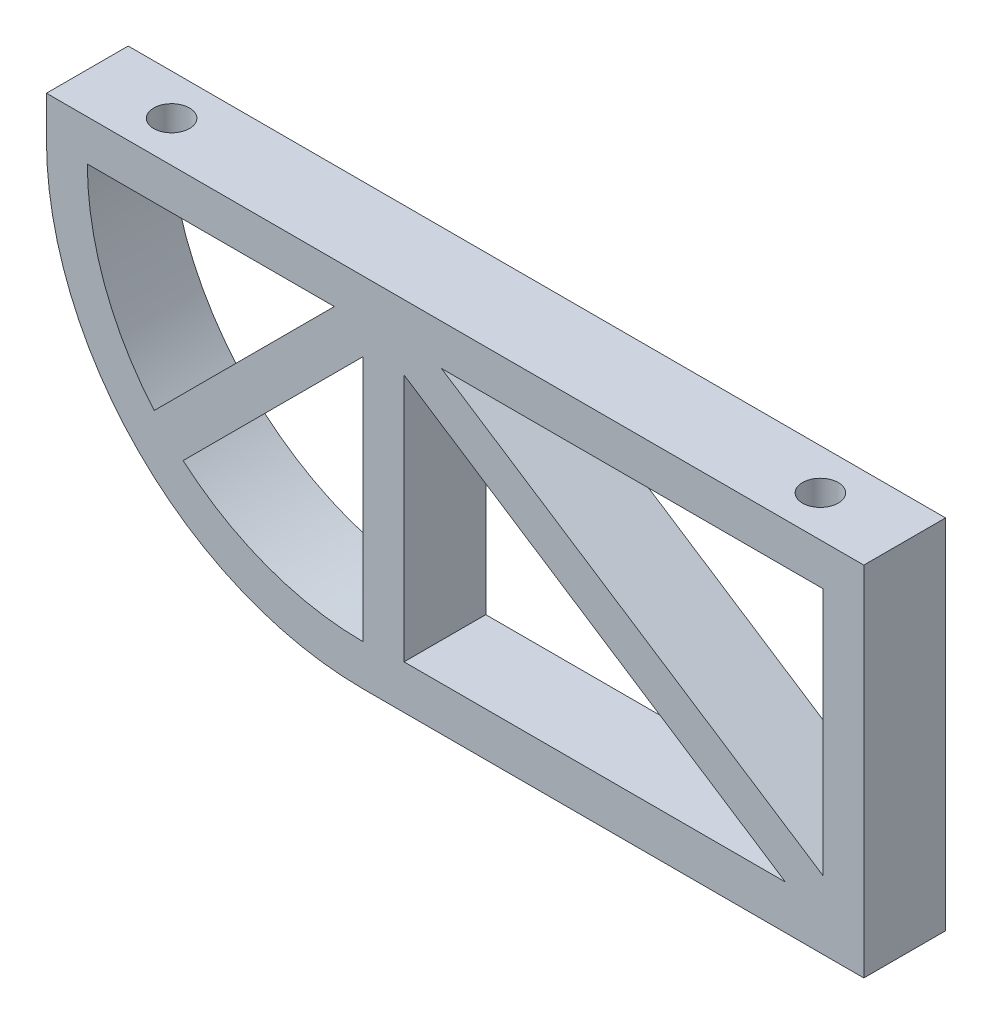
ISO-10303-21;
HEADER;
FILE_DESCRIPTION(('STEP AP214'),'2;1');
FILE_NAME('part.step','',(''),(''),'','','');
FILE_SCHEMA(('AUTOMOTIVE_DESIGN { 1 0 10303 214 1 1 1 1 }'));
ENDSEC;
DATA;
#1=APPLICATION_CONTEXT('core data for automotive mechanical design processes');
#2=APPLICATION_PROTOCOL_DEFINITION('international standard','automotive_design',2000,#1);
#3=PRODUCT_CONTEXT('',#1,'mechanical');
#4=PRODUCT('Part','Part','',(#3));
#5=PRODUCT_RELATED_PRODUCT_CATEGORY('part','',(#4));
#6=PRODUCT_DEFINITION_FORMATION('','',#4);
#7=PRODUCT_DEFINITION_CONTEXT('part definition',#1,'design');
#8=PRODUCT_DEFINITION('design','',#6,#7);
#9=PRODUCT_DEFINITION_SHAPE('','',#8);
#10=(LENGTH_UNIT() NAMED_UNIT(*) SI_UNIT(.MILLI.,.METRE.));
#11=(NAMED_UNIT(*) PLANE_ANGLE_UNIT() SI_UNIT($,.RADIAN.));
#12=(NAMED_UNIT(*) SI_UNIT($,.STERADIAN.) SOLID_ANGLE_UNIT());
#13=UNCERTAINTY_MEASURE_WITH_UNIT(LENGTH_MEASURE(1.E-05),#10,'distance_accuracy_value','');
#14=(GEOMETRIC_REPRESENTATION_CONTEXT(3) GLOBAL_UNCERTAINTY_ASSIGNED_CONTEXT((#13)) GLOBAL_UNIT_ASSIGNED_CONTEXT((#10,
#11,#12)) REPRESENTATION_CONTEXT('',''));
#15=CARTESIAN_POINT('',(0.,0.,0.));
#16=DIRECTION('',(0.,0.,1.));
#17=DIRECTION('',(1.,0.,0.));
#18=AXIS2_PLACEMENT_3D('',#15,#16,#17);
#19=CARTESIAN_POINT('',(4.89844082211197,12.6074060949681,8.));
#20=DIRECTION('',(0.,0.,-1.));
#21=DIRECTION('',(-1.,0.,0.));
#22=AXIS2_PLACEMENT_3D('',#19,#20,#21);
#23=CYLINDRICAL_SURFACE('',#22,27.);
#24=CARTESIAN_POINT('',(4.89844082211197,12.6074060949681,0.));
#25=DIRECTION('',(0.,0.,1.));
#26=DIRECTION('',(1.,0.,0.));
#27=AXIS2_PLACEMENT_3D('',#24,#25,#26);
#28=CIRCLE('',#27,27.);
#29=CARTESIAN_POINT('',(-12.7267783801747,-7.84624023206477,0.));
#30=VERTEX_POINT('',#29);
#31=CARTESIAN_POINT('',(4.89844082211197,-14.3925939050319,0.));
#32=VERTEX_POINT('',#31);
#33=EDGE_CURVE('E298',#30,#32,#28,.T.);
#34=ORIENTED_EDGE('',*,*,#33,.F.);
#35=DIRECTION('',(0.,0.,-1.));
#36=VECTOR('',#35,1.);
#37=CARTESIAN_POINT('',(-12.7267783801747,-7.84624023206477,8.));
#38=LINE('',#37,#36);
#39=CARTESIAN_POINT('',(-12.7267783801747,-7.84624023206477,8.));
#40=VERTEX_POINT('',#39);
#41=EDGE_CURVE('E106',#40,#30,#38,.T.);
#42=ORIENTED_EDGE('',*,*,#41,.F.);
#43=CARTESIAN_POINT('',(4.89844082211197,12.6074060949681,8.));
#44=DIRECTION('',(0.,0.,1.));
#45=DIRECTION('',(1.,0.,0.));
#46=AXIS2_PLACEMENT_3D('',#43,#44,#45);
#47=CIRCLE('',#46,27.);
#48=CARTESIAN_POINT('',(4.89844082211197,-14.3925939050319,8.));
#49=VERTEX_POINT('',#48);
#50=EDGE_CURVE('E251',#40,#49,#47,.T.);
#51=ORIENTED_EDGE('',*,*,#50,.T.);
#52=DIRECTION('',(0.,0.,-1.));
#53=VECTOR('',#52,1.);
#54=CARTESIAN_POINT('',(4.89844082211197,-14.3925939050319,8.));
#55=LINE('',#54,#53);
#56=EDGE_CURVE('E12',#49,#32,#55,.T.);
#57=ORIENTED_EDGE('',*,*,#56,.T.);
#58=EDGE_LOOP('',(#34,#42,#51,#57));
#59=FACE_BOUND('',#58,.T.);
#60=ADVANCED_FACE('F95',(#59),#23,.F.);
#61=CARTESIAN_POINT('',(-22.101559177888,12.6074060949681,0.));
#62=VERTEX_POINT('',#61);
#63=CARTESIAN_POINT('',(-15.5552055049209,-5.01781310731857,0.));
#64=VERTEX_POINT('',#63);
#65=EDGE_CURVE('E232',#62,#64,#28,.T.);
#66=ORIENTED_EDGE('',*,*,#65,.F.);
#67=DIRECTION('',(0.,0.,-1.));
#68=VECTOR('',#67,1.);
#69=CARTESIAN_POINT('',(-22.101559177888,12.6074060949681,8.));
#70=LINE('',#69,#68);
#71=CARTESIAN_POINT('',(-22.101559177888,12.6074060949681,8.));
#72=VERTEX_POINT('',#71);
#73=EDGE_CURVE('E226',#72,#62,#70,.T.);
#74=ORIENTED_EDGE('',*,*,#73,.F.);
#75=CARTESIAN_POINT('',(-15.5552055049209,-5.01781310731857,8.));
#76=VERTEX_POINT('',#75);
#77=EDGE_CURVE('E230',#72,#76,#47,.T.);
#78=ORIENTED_EDGE('',*,*,#77,.T.);
#79=DIRECTION('',(0.,0.,-1.));
#80=VECTOR('',#79,1.);
#81=CARTESIAN_POINT('',(-15.5552055049209,-5.01781310731857,8.));
#82=LINE('',#81,#80);
#83=EDGE_CURVE('E237',#76,#64,#82,.T.);
#84=ORIENTED_EDGE('',*,*,#83,.T.);
#85=EDGE_LOOP('',(#66,#74,#78,#84));
#86=FACE_BOUND('',#85,.T.);
#87=ADVANCED_FACE('F228',(#86),#23,.F.);
#88=CARTESIAN_POINT('',(0.,12.6074060949681,8.));
#89=DIRECTION('',(0.,1.,0.));
#90=DIRECTION('',(-1.,0.,0.));
#91=AXIS2_PLACEMENT_3D('',#88,#89,#90);
#92=PLANE('',#91);
#93=CARTESIAN_POINT('',(-17.851559177888,12.6074060949681,4.));
#94=DIRECTION('',(0.,1.,0.));
#95=DIRECTION('',(-1.,0.,0.));
#96=AXIS2_PLACEMENT_3D('',#93,#94,#95);
#97=CIRCLE('',#96,1.75);
#98=CARTESIAN_POINT('',(-19.601559177888,12.6074060949681,4.));
#99=VERTEX_POINT('',#98);
#100=EDGE_CURVE('E367',#99,#99,#97,.T.);
#101=ORIENTED_EDGE('',*,*,#100,.T.);
#102=EDGE_LOOP('',(#101));
#103=FACE_BOUND('',#102,.T.);
#104=DIRECTION('',(1.,0.,0.));
#105=VECTOR('',#104,1.);
#106=CARTESIAN_POINT('',(0.,12.6074060949681,0.));
#107=LINE('',#106,#105);
#108=CARTESIAN_POINT('',(2.07001369736578,12.6074060949681,0.));
#109=VERTEX_POINT('',#108);
#110=EDGE_CURVE('E283',#62,#109,#107,.T.);
#111=ORIENTED_EDGE('',*,*,#110,.T.);
#112=DIRECTION('',(0.,0.,-1.));
#113=VECTOR('',#112,1.);
#114=CARTESIAN_POINT('',(2.07001369736578,12.6074060949681,8.));
#115=LINE('',#114,#113);
#116=CARTESIAN_POINT('',(2.07001369736578,12.6074060949681,8.));
#117=VERTEX_POINT('',#116);
#118=EDGE_CURVE('E170',#117,#109,#115,.T.);
#119=ORIENTED_EDGE('',*,*,#118,.F.);
#120=DIRECTION('',(1.,0.,0.));
#121=VECTOR('',#120,1.);
#122=CARTESIAN_POINT('',(0.,12.6074060949681,8.));
#123=LINE('',#122,#121);
#124=EDGE_CURVE('E240',#72,#117,#123,.T.);
#125=ORIENTED_EDGE('',*,*,#124,.F.);
#126=ORIENTED_EDGE('',*,*,#73,.T.);
#127=EDGE_LOOP('',(#111,#119,#125,#126));
#128=FACE_BOUND('',#127,.T.);
#129=ADVANCED_FACE('F241',(#103,#128),#92,.F.);
#130=CARTESIAN_POINT('',(4.89844082211197,0.,8.));
#131=DIRECTION('',(1.,0.,0.));
#132=DIRECTION('',(0.,0.,-1.));
#133=AXIS2_PLACEMENT_3D('',#130,#131,#132);
#134=PLANE('',#133);
#135=DIRECTION('',(0.,-1.,0.));
#136=VECTOR('',#135,1.);
#137=CARTESIAN_POINT('',(4.89844082211197,0.,0.));
#138=LINE('',#137,#136);
#139=CARTESIAN_POINT('',(4.89844082211197,9.77897897022191,0.));
#140=VERTEX_POINT('',#139);
#141=EDGE_CURVE('E295',#140,#32,#138,.T.);
#142=ORIENTED_EDGE('',*,*,#141,.T.);
#143=ORIENTED_EDGE('',*,*,#56,.F.);
#144=DIRECTION('',(0.,-1.,0.));
#145=VECTOR('',#144,1.);
#146=CARTESIAN_POINT('',(4.89844082211197,0.,8.));
#147=LINE('',#146,#145);
#148=CARTESIAN_POINT('',(4.89844082211197,9.77897897022191,8.));
#149=VERTEX_POINT('',#148);
#150=EDGE_CURVE('E255',#149,#49,#147,.T.);
#151=ORIENTED_EDGE('',*,*,#150,.F.);
#152=DIRECTION('',(0.,0.,-1.));
#153=VECTOR('',#152,1.);
#154=CARTESIAN_POINT('',(4.89844082211197,9.77897897022191,8.));
#155=LINE('',#154,#153);
#156=EDGE_CURVE('E115',#149,#140,#155,.T.);
#157=ORIENTED_EDGE('',*,*,#156,.T.);
#158=EDGE_LOOP('',(#142,#143,#151,#157));
#159=FACE_BOUND('',#158,.T.);
#160=ADVANCED_FACE('F417',(#159),#134,.F.);
#161=CARTESIAN_POINT('',(49.898440822112,0.,8.));
#162=DIRECTION('',(1.,0.,0.));
#163=DIRECTION('',(0.,0.,-1.));
#164=AXIS2_PLACEMENT_3D('',#161,#162,#163);
#165=PLANE('',#164);
#166=DIRECTION('',(0.,-1.,0.));
#167=VECTOR('',#166,1.);
#168=CARTESIAN_POINT('',(49.898440822112,0.,0.));
#169=LINE('',#168,#167);
#170=CARTESIAN_POINT('',(49.898440822112,12.6074060949681,0.));
#171=VERTEX_POINT('',#170);
#172=CARTESIAN_POINT('',(49.898440822112,-11.7078967120888,0.));
#173=VERTEX_POINT('',#172);
#174=EDGE_CURVE('E282',#171,#173,#169,.T.);
#175=ORIENTED_EDGE('',*,*,#174,.T.);
#176=DIRECTION('',(0.,0.,-1.));
#177=VECTOR('',#176,1.);
#178=CARTESIAN_POINT('',(49.898440822112,-11.7078967120888,8.));
#179=LINE('',#178,#177);
#180=CARTESIAN_POINT('',(49.898440822112,-11.7078967120888,8.));
#181=VERTEX_POINT('',#180);
#182=EDGE_CURVE('E324',#181,#173,#179,.T.);
#183=ORIENTED_EDGE('',*,*,#182,.F.);
#184=DIRECTION('',(0.,-1.,0.));
#185=VECTOR('',#184,1.);
#186=CARTESIAN_POINT('',(49.898440822112,0.,8.));
#187=LINE('',#186,#185);
#188=CARTESIAN_POINT('',(49.898440822112,12.6074060949681,8.));
#189=VERTEX_POINT('',#188);
#190=EDGE_CURVE('E402',#189,#181,#187,.T.);
#191=ORIENTED_EDGE('',*,*,#190,.F.);
#192=DIRECTION('',(0.,0.,-1.));
#193=VECTOR('',#192,1.);
#194=CARTESIAN_POINT('',(49.898440822112,12.6074060949681,8.));
#195=LINE('',#194,#193);
#196=EDGE_CURVE('E304',#189,#171,#195,.T.);
#197=ORIENTED_EDGE('',*,*,#196,.T.);
#198=EDGE_LOOP('',(#175,#183,#191,#197));
#199=FACE_BOUND('',#198,.T.);
#200=ADVANCED_FACE('F439',(#199),#165,.F.);
#201=CARTESIAN_POINT('',(0.,-14.0946537506693,8.));
#202=DIRECTION('',(0.,-1.,0.));
#203=DIRECTION('',(0.,0.,-1.));
#204=AXIS2_PLACEMENT_3D('',#201,#202,#203);
#205=PLANE('',#204);
#206=DIRECTION('',(-1.,0.,0.));
#207=VECTOR('',#206,1.);
#208=CARTESIAN_POINT('',(0.,-14.0946537506693,0.));
#209=LINE('',#208,#207);
#210=CARTESIAN_POINT('',(46.2336659265607,-14.0946537506693,0.));
#211=VERTEX_POINT('',#210);
#212=CARTESIAN_POINT('',(8.89844082211197,-14.0946537506693,0.));
#213=VERTEX_POINT('',#212);
#214=EDGE_CURVE('E287',#211,#213,#209,.T.);
#215=ORIENTED_EDGE('',*,*,#214,.T.);
#216=DIRECTION('',(0.,0.,-1.));
#217=VECTOR('',#216,1.);
#218=CARTESIAN_POINT('',(8.89844082211197,-14.0946537506693,8.));
#219=LINE('',#218,#217);
#220=CARTESIAN_POINT('',(8.89844082211197,-14.0946537506693,8.));
#221=VERTEX_POINT('',#220);
#222=EDGE_CURVE('E318',#221,#213,#219,.T.);
#223=ORIENTED_EDGE('',*,*,#222,.F.);
#224=DIRECTION('',(-1.,0.,0.));
#225=VECTOR('',#224,1.);
#226=CARTESIAN_POINT('',(0.,-14.0946537506693,8.));
#227=LINE('',#226,#225);
#228=CARTESIAN_POINT('',(46.2336659265607,-14.0946537506693,8.));
#229=VERTEX_POINT('',#228);
#230=EDGE_CURVE('E406',#229,#221,#227,.T.);
#231=ORIENTED_EDGE('',*,*,#230,.F.);
#232=DIRECTION('',(0.,0.,-1.));
#233=VECTOR('',#232,1.);
#234=CARTESIAN_POINT('',(46.2336659265607,-14.0946537506693,8.));
#235=LINE('',#234,#233);
#236=EDGE_CURVE('E321',#229,#211,#235,.T.);
#237=ORIENTED_EDGE('',*,*,#236,.T.);
#238=EDGE_LOOP('',(#215,#223,#231,#237));
#239=FACE_BOUND('',#238,.T.);
#240=ADVANCED_FACE('F444',(#239),#205,.F.);
#241=CARTESIAN_POINT('',(8.89844082211197,0.,8.));
#242=DIRECTION('',(1.,0.,0.));
#243=DIRECTION('',(0.,0.,-1.));
#244=AXIS2_PLACEMENT_3D('',#241,#242,#243);
#245=PLANE('',#244);
#246=DIRECTION('',(0.,-1.,0.));
#247=VECTOR('',#246,1.);
#248=CARTESIAN_POINT('',(8.89844082211197,0.,0.));
#249=LINE('',#248,#247);
#250=CARTESIAN_POINT('',(8.89844082211197,10.2206490563876,0.));
#251=VERTEX_POINT('',#250);
#252=EDGE_CURVE('E291',#251,#213,#249,.T.);
#253=ORIENTED_EDGE('',*,*,#252,.F.);
#254=DIRECTION('',(0.,0.,-1.));
#255=VECTOR('',#254,1.);
#256=CARTESIAN_POINT('',(8.89844082211197,10.2206490563876,8.));
#257=LINE('',#256,#255);
#258=CARTESIAN_POINT('',(8.89844082211197,10.2206490563876,8.));
#259=VERTEX_POINT('',#258);
#260=EDGE_CURVE('E314',#259,#251,#257,.T.);
#261=ORIENTED_EDGE('',*,*,#260,.F.);
#262=DIRECTION('',(0.,-1.,0.));
#263=VECTOR('',#262,1.);
#264=CARTESIAN_POINT('',(8.89844082211197,0.,8.));
#265=LINE('',#264,#263);
#266=EDGE_CURVE('E408',#259,#221,#265,.T.);
#267=ORIENTED_EDGE('',*,*,#266,.T.);
#268=ORIENTED_EDGE('',*,*,#222,.T.);
#269=EDGE_LOOP('',(#253,#261,#267,#268));
#270=FACE_BOUND('',#269,.T.);
#271=ADVANCED_FACE('F440',(#270),#245,.T.);
#272=CARTESIAN_POINT('',(45.648440822112,12.6074060949681,4.));
#273=DIRECTION('',(0.,1.,0.));
#274=DIRECTION('',(-1.,0.,0.));
#275=AXIS2_PLACEMENT_3D('',#272,#273,#274);
#276=CIRCLE('',#275,1.75);
#277=CARTESIAN_POINT('',(43.898440822112,12.6074060949681,4.));
#278=VERTEX_POINT('',#277);
#279=EDGE_CURVE('E374',#278,#278,#276,.T.);
#280=ORIENTED_EDGE('',*,*,#279,.T.);
#281=EDGE_LOOP('',(#280));
#282=FACE_BOUND('',#281,.T.);
#283=CARTESIAN_POINT('',(12.5632157176633,12.6074060949681,0.));
#284=VERTEX_POINT('',#283);
#285=EDGE_CURVE('E278',#284,#171,#107,.T.);
#286=ORIENTED_EDGE('',*,*,#285,.T.);
#287=ORIENTED_EDGE('',*,*,#196,.F.);
#288=CARTESIAN_POINT('',(12.5632157176633,12.6074060949681,8.));
#289=VERTEX_POINT('',#288);
#290=EDGE_CURVE('E247',#289,#189,#123,.T.);
#291=ORIENTED_EDGE('',*,*,#290,.F.);
#292=DIRECTION('',(0.,0.,-1.));
#293=VECTOR('',#292,1.);
#294=CARTESIAN_POINT('',(12.5632157176633,12.6074060949681,8.));
#295=LINE('',#294,#293);
#296=EDGE_CURVE('E311',#289,#284,#295,.T.);
#297=ORIENTED_EDGE('',*,*,#296,.T.);
#298=EDGE_LOOP('',(#286,#287,#291,#297));
#299=FACE_BOUND('',#298,.T.);
#300=ADVANCED_FACE('F443',(#282,#299),#92,.F.);
#301=CARTESIAN_POINT('',(53.898440822112,0.,8.));
#302=DIRECTION('',(1.,0.,0.));
#303=DIRECTION('',(0.,0.,-1.));
#304=AXIS2_PLACEMENT_3D('',#301,#302,#303);
#305=PLANE('',#304);
#306=DIRECTION('',(0.,-1.,0.));
#307=VECTOR('',#306,1.);
#308=CARTESIAN_POINT('',(53.898440822112,0.,0.));
#309=LINE('',#308,#307);
#310=CARTESIAN_POINT('',(53.898440822112,16.6074060949681,0.));
#311=VERTEX_POINT('',#310);
#312=CARTESIAN_POINT('',(53.898440822112,-18.3925939050319,0.));
#313=VERTEX_POINT('',#312);
#314=EDGE_CURVE('E263',#311,#313,#309,.T.);
#315=ORIENTED_EDGE('',*,*,#314,.F.);
#316=DIRECTION('',(0.,0.,-1.));
#317=VECTOR('',#316,1.);
#318=CARTESIAN_POINT('',(53.898440822112,16.6074060949681,8.));
#319=LINE('',#318,#317);
#320=CARTESIAN_POINT('',(53.898440822112,16.6074060949681,8.));
#321=VERTEX_POINT('',#320);
#322=EDGE_CURVE('E340',#321,#311,#319,.T.);
#323=ORIENTED_EDGE('',*,*,#322,.F.);
#324=DIRECTION('',(0.,-1.,0.));
#325=VECTOR('',#324,1.);
#326=CARTESIAN_POINT('',(53.898440822112,0.,8.));
#327=LINE('',#326,#325);
#328=CARTESIAN_POINT('',(53.898440822112,-18.3925939050319,8.));
#329=VERTEX_POINT('',#328);
#330=EDGE_CURVE('E386',#321,#329,#327,.T.);
#331=ORIENTED_EDGE('',*,*,#330,.T.);
#332=DIRECTION('',(0.,0.,-1.));
#333=VECTOR('',#332,1.);
#334=CARTESIAN_POINT('',(53.898440822112,-18.3925939050319,8.));
#335=LINE('',#334,#333);
#336=EDGE_CURVE('E315',#329,#313,#335,.T.);
#337=ORIENTED_EDGE('',*,*,#336,.T.);
#338=EDGE_LOOP('',(#315,#323,#331,#337));
#339=FACE_BOUND('',#338,.T.);
#340=ADVANCED_FACE('F463',(#339),#305,.T.);
#341=CARTESIAN_POINT('',(0.,16.6074060949681,8.));
#342=DIRECTION('',(0.,1.,0.));
#343=DIRECTION('',(0.,0.,1.));
#344=AXIS2_PLACEMENT_3D('',#341,#342,#343);
#345=PLANE('',#344);
#346=CARTESIAN_POINT('',(-17.851559177888,16.6074060949681,4.));
#347=DIRECTION('',(0.,1.,0.));
#348=DIRECTION('',(0.,0.,1.));
#349=AXIS2_PLACEMENT_3D('',#346,#347,#348);
#350=CIRCLE('',#349,1.75);
#351=CARTESIAN_POINT('',(-17.851559177888,16.6074060949681,5.75));
#352=VERTEX_POINT('',#351);
#353=EDGE_CURVE('E380',#352,#352,#350,.T.);
#354=ORIENTED_EDGE('',*,*,#353,.F.);
#355=EDGE_LOOP('',(#354));
#356=FACE_BOUND('',#355,.T.);
#357=CARTESIAN_POINT('',(45.648440822112,16.6074060949681,4.));
#358=DIRECTION('',(0.,1.,0.));
#359=DIRECTION('',(0.,0.,1.));
#360=AXIS2_PLACEMENT_3D('',#357,#358,#359);
#361=CIRCLE('',#360,1.75);
#362=CARTESIAN_POINT('',(45.648440822112,16.6074060949681,5.75));
#363=VERTEX_POINT('',#362);
#364=EDGE_CURVE('E606',#363,#363,#361,.T.);
#365=ORIENTED_EDGE('',*,*,#364,.F.);
#366=EDGE_LOOP('',(#365));
#367=FACE_BOUND('',#366,.T.);
#368=DIRECTION('',(1.,0.,0.));
#369=VECTOR('',#368,1.);
#370=CARTESIAN_POINT('',(0.,16.6074060949681,0.));
#371=LINE('',#370,#369);
#372=CARTESIAN_POINT('',(-26.101559177888,16.6074060949681,0.));
#373=VERTEX_POINT('',#372);
#374=EDGE_CURVE('E268',#373,#311,#371,.T.);
#375=ORIENTED_EDGE('',*,*,#374,.F.);
#376=DIRECTION('',(0.,0.,-1.));
#377=VECTOR('',#376,1.);
#378=CARTESIAN_POINT('',(-26.101559177888,16.6074060949681,8.));
#379=LINE('',#378,#377);
#380=CARTESIAN_POINT('',(-26.101559177888,16.6074060949681,8.));
#381=VERTEX_POINT('',#380);
#382=EDGE_CURVE('E337',#381,#373,#379,.T.);
#383=ORIENTED_EDGE('',*,*,#382,.F.);
#384=DIRECTION('',(1.,0.,0.));
#385=VECTOR('',#384,1.);
#386=CARTESIAN_POINT('',(0.,16.6074060949681,8.));
#387=LINE('',#386,#385);
#388=EDGE_CURVE('E390',#381,#321,#387,.T.);
#389=ORIENTED_EDGE('',*,*,#388,.T.);
#390=ORIENTED_EDGE('',*,*,#322,.T.);
#391=EDGE_LOOP('',(#375,#383,#389,#390));
#392=FACE_BOUND('',#391,.T.);
#393=ADVANCED_FACE('F459',(#356,#367,#392),#345,.T.);
#394=CARTESIAN_POINT('',(-26.101559177888,0.,8.));
#395=DIRECTION('',(1.,0.,0.));
#396=DIRECTION('',(0.,0.,-1.));
#397=AXIS2_PLACEMENT_3D('',#394,#395,#396);
#398=PLANE('',#397);
#399=DIRECTION('',(0.,-1.,0.));
#400=VECTOR('',#399,1.);
#401=CARTESIAN_POINT('',(-26.101559177888,0.,0.));
#402=LINE('',#401,#400);
#403=CARTESIAN_POINT('',(-26.101559177888,12.6074060949681,0.));
#404=VERTEX_POINT('',#403);
#405=EDGE_CURVE('E272',#373,#404,#402,.T.);
#406=ORIENTED_EDGE('',*,*,#405,.T.);
#407=DIRECTION('',(0.,0.,-1.));
#408=VECTOR('',#407,1.);
#409=CARTESIAN_POINT('',(-26.101559177888,12.6074060949681,8.));
#410=LINE('',#409,#408);
#411=CARTESIAN_POINT('',(-26.101559177888,12.6074060949681,8.));
#412=VERTEX_POINT('',#411);
#413=EDGE_CURVE('E333',#412,#404,#410,.T.);
#414=ORIENTED_EDGE('',*,*,#413,.F.);
#415=DIRECTION('',(0.,-1.,0.));
#416=VECTOR('',#415,1.);
#417=CARTESIAN_POINT('',(-26.101559177888,0.,8.));
#418=LINE('',#417,#416);
#419=EDGE_CURVE('E394',#381,#412,#418,.T.);
#420=ORIENTED_EDGE('',*,*,#419,.F.);
#421=ORIENTED_EDGE('',*,*,#382,.T.);
#422=EDGE_LOOP('',(#406,#414,#420,#421));
#423=FACE_BOUND('',#422,.T.);
#424=ADVANCED_FACE('F455',(#423),#398,.F.);
#425=CARTESIAN_POINT('',(4.89844082211197,12.6074060949681,8.));
#426=DIRECTION('',(0.,0.,-1.));
#427=DIRECTION('',(-1.,0.,0.));
#428=AXIS2_PLACEMENT_3D('',#425,#426,#427);
#429=CYLINDRICAL_SURFACE('',#428,31.);
#430=CARTESIAN_POINT('',(4.89844082211197,12.6074060949681,0.));
#431=DIRECTION('',(0.,0.,1.));
#432=DIRECTION('',(1.,0.,0.));
#433=AXIS2_PLACEMENT_3D('',#430,#431,#432);
#434=CIRCLE('',#433,31.);
#435=CARTESIAN_POINT('',(4.89844082211197,-18.3925939050319,0.));
#436=VERTEX_POINT('',#435);
#437=EDGE_CURVE('E275',#404,#436,#434,.T.);
#438=ORIENTED_EDGE('',*,*,#437,.T.);
#439=DIRECTION('',(0.,0.,-1.));
#440=VECTOR('',#439,1.);
#441=CARTESIAN_POINT('',(4.89844082211197,-18.3925939050319,8.));
#442=LINE('',#441,#440);
#443=CARTESIAN_POINT('',(4.89844082211197,-18.3925939050319,8.));
#444=VERTEX_POINT('',#443);
#445=EDGE_CURVE('E245',#444,#436,#442,.T.);
#446=ORIENTED_EDGE('',*,*,#445,.F.);
#447=CARTESIAN_POINT('',(4.89844082211197,12.6074060949681,8.));
#448=DIRECTION('',(0.,0.,1.));
#449=DIRECTION('',(1.,0.,0.));
#450=AXIS2_PLACEMENT_3D('',#447,#448,#449);
#451=CIRCLE('',#450,31.);
#452=EDGE_CURVE('E397',#412,#444,#451,.T.);
#453=ORIENTED_EDGE('',*,*,#452,.F.);
#454=ORIENTED_EDGE('',*,*,#413,.T.);
#455=EDGE_LOOP('',(#438,#446,#453,#454));
#456=FACE_BOUND('',#455,.T.);
#457=ADVANCED_FACE('F451',(#456),#429,.T.);
#458=CARTESIAN_POINT('',(0.,-18.3925939050319,8.));
#459=DIRECTION('',(0.,1.,0.));
#460=DIRECTION('',(0.,0.,1.));
#461=AXIS2_PLACEMENT_3D('',#458,#459,#460);
#462=PLANE('',#461);
#463=DIRECTION('',(1.,0.,0.));
#464=VECTOR('',#463,1.);
#465=CARTESIAN_POINT('',(0.,-18.3925939050319,0.));
#466=LINE('',#465,#464);
#467=EDGE_CURVE('E259',#436,#313,#466,.T.);
#468=ORIENTED_EDGE('',*,*,#467,.T.);
#469=ORIENTED_EDGE('',*,*,#336,.F.);
#470=DIRECTION('',(1.,0.,0.));
#471=VECTOR('',#470,1.);
#472=CARTESIAN_POINT('',(0.,-18.3925939050319,8.));
#473=LINE('',#472,#471);
#474=EDGE_CURVE('E183',#444,#329,#473,.T.);
#475=ORIENTED_EDGE('',*,*,#474,.F.);
#476=ORIENTED_EDGE('',*,*,#445,.T.);
#477=EDGE_LOOP('',(#468,#469,#475,#476));
#478=FACE_BOUND('',#477,.T.);
#479=ADVANCED_FACE('F454',(#478),#462,.F.);
#480=CARTESIAN_POINT('',(0.,0.,0.));
#481=DIRECTION('',(0.,0.,1.));
#482=DIRECTION('',(1.,0.,0.));
#483=AXIS2_PLACEMENT_3D('',#480,#481,#482);
#484=PLANE('',#483);
#485=DIRECTION('',(0.83795709729612,-0.545736111221404,0.));
#486=VECTOR('',#485,1.);
#487=CARTESIAN_POINT('',(9.98991304455478,14.2833202895603,0.));
#488=LINE('',#487,#486);
#489=EDGE_CURVE('E349',#284,#173,#488,.T.);
#490=ORIENTED_EDGE('',*,*,#489,.T.);
#491=ORIENTED_EDGE('',*,*,#174,.F.);
#492=ORIENTED_EDGE('',*,*,#285,.F.);
#493=EDGE_LOOP('',(#490,#491,#492));
#494=FACE_BOUND('',#493,.T.);
#495=DIRECTION('',(0.83795709729612,-0.545736111221404,0.));
#496=VECTOR('',#495,1.);
#497=CARTESIAN_POINT('',(7.80696859966916,10.9314919003759,0.));
#498=LINE('',#497,#496);
#499=EDGE_CURVE('E353',#251,#211,#498,.T.);
#500=ORIENTED_EDGE('',*,*,#499,.F.);
#501=ORIENTED_EDGE('',*,*,#252,.T.);
#502=ORIENTED_EDGE('',*,*,#214,.F.);
#503=EDGE_LOOP('',(#500,#501,#502));
#504=FACE_BOUND('',#503,.T.);
#505=DIRECTION('',(-0.707106781186548,-0.707106781186548,0.));
#506=VECTOR('',#505,1.);
#507=CARTESIAN_POINT('',(6.31265438448506,11.193192532595,0.));
#508=LINE('',#507,#506);
#509=EDGE_CURVE('E364',#140,#30,#508,.T.);
#510=ORIENTED_EDGE('',*,*,#509,.T.);
#511=ORIENTED_EDGE('',*,*,#33,.T.);
#512=ORIENTED_EDGE('',*,*,#141,.F.);
#513=EDGE_LOOP('',(#510,#511,#512));
#514=FACE_BOUND('',#513,.T.);
#515=DIRECTION('',(-0.707106781186548,-0.707106781186548,0.));
#516=VECTOR('',#515,1.);
#517=CARTESIAN_POINT('',(3.48422725973887,14.0216196573412,0.));
#518=LINE('',#517,#516);
#519=EDGE_CURVE('E99',#109,#64,#518,.T.);
#520=ORIENTED_EDGE('',*,*,#519,.F.);
#521=ORIENTED_EDGE('',*,*,#110,.F.);
#522=ORIENTED_EDGE('',*,*,#65,.T.);
#523=EDGE_LOOP('',(#520,#521,#522));
#524=FACE_BOUND('',#523,.T.);
#525=ORIENTED_EDGE('',*,*,#467,.F.);
#526=ORIENTED_EDGE('',*,*,#437,.F.);
#527=ORIENTED_EDGE('',*,*,#405,.F.);
#528=ORIENTED_EDGE('',*,*,#374,.T.);
#529=ORIENTED_EDGE('',*,*,#314,.T.);
#530=EDGE_LOOP('',(#525,#526,#527,#528,#529));
#531=FACE_BOUND('',#530,.T.);
#532=ADVANCED_FACE('F470',(#494,#504,#514,#524,#531),#484,.F.);
#533=CARTESIAN_POINT('',(0.,0.,8.));
#534=DIRECTION('',(0.,0.,1.));
#535=DIRECTION('',(1.,0.,0.));
#536=AXIS2_PLACEMENT_3D('',#533,#534,#535);
#537=PLANE('',#536);
#538=ORIENTED_EDGE('',*,*,#190,.T.);
#539=DIRECTION('',(0.83795709729612,-0.545736111221404,0.));
#540=VECTOR('',#539,1.);
#541=CARTESIAN_POINT('',(9.98991304455478,14.2833202895603,8.));
#542=LINE('',#541,#540);
#543=EDGE_CURVE('E264',#289,#181,#542,.T.);
#544=ORIENTED_EDGE('',*,*,#543,.F.);
#545=ORIENTED_EDGE('',*,*,#290,.T.);
#546=EDGE_LOOP('',(#538,#544,#545));
#547=FACE_BOUND('',#546,.T.);
#548=ORIENTED_EDGE('',*,*,#266,.F.);
#549=DIRECTION('',(0.83795709729612,-0.545736111221404,0.));
#550=VECTOR('',#549,1.);
#551=CARTESIAN_POINT('',(7.80696859966916,10.9314919003759,8.));
#552=LINE('',#551,#550);
#553=EDGE_CURVE('E345',#259,#229,#552,.T.);
#554=ORIENTED_EDGE('',*,*,#553,.T.);
#555=ORIENTED_EDGE('',*,*,#230,.T.);
#556=EDGE_LOOP('',(#548,#554,#555));
#557=FACE_BOUND('',#556,.T.);
#558=ORIENTED_EDGE('',*,*,#50,.F.);
#559=DIRECTION('',(-0.707106781186548,-0.707106781186548,0.));
#560=VECTOR('',#559,1.);
#561=CARTESIAN_POINT('',(6.31265438448506,11.193192532595,8.));
#562=LINE('',#561,#560);
#563=EDGE_CURVE('E360',#149,#40,#562,.T.);
#564=ORIENTED_EDGE('',*,*,#563,.F.);
#565=ORIENTED_EDGE('',*,*,#150,.T.);
#566=EDGE_LOOP('',(#558,#564,#565));
#567=FACE_BOUND('',#566,.T.);
#568=ORIENTED_EDGE('',*,*,#124,.T.);
#569=DIRECTION('',(-0.707106781186548,-0.707106781186548,0.));
#570=VECTOR('',#569,1.);
#571=CARTESIAN_POINT('',(3.48422725973887,14.0216196573412,8.));
#572=LINE('',#571,#570);
#573=EDGE_CURVE('E249',#117,#76,#572,.T.);
#574=ORIENTED_EDGE('',*,*,#573,.T.);
#575=ORIENTED_EDGE('',*,*,#77,.F.);
#576=EDGE_LOOP('',(#568,#574,#575));
#577=FACE_BOUND('',#576,.T.);
#578=ORIENTED_EDGE('',*,*,#474,.T.);
#579=ORIENTED_EDGE('',*,*,#330,.F.);
#580=ORIENTED_EDGE('',*,*,#388,.F.);
#581=ORIENTED_EDGE('',*,*,#419,.T.);
#582=ORIENTED_EDGE('',*,*,#452,.T.);
#583=EDGE_LOOP('',(#578,#579,#580,#581,#582));
#584=FACE_BOUND('',#583,.T.);
#585=ADVANCED_FACE('F248',(#547,#557,#567,#577,#584),#537,.T.);
#586=CARTESIAN_POINT('',(3.48422725973887,14.0216196573412,8.));
#587=DIRECTION('',(0.707106781186547,-0.707106781186547,0.));
#588=DIRECTION('',(0.707106781186548,0.707106781186548,0.));
#589=AXIS2_PLACEMENT_3D('',#586,#587,#588);
#590=PLANE('',#589);
#591=ORIENTED_EDGE('',*,*,#83,.F.);
#592=ORIENTED_EDGE('',*,*,#573,.F.);
#593=ORIENTED_EDGE('',*,*,#118,.T.);
#594=ORIENTED_EDGE('',*,*,#519,.T.);
#595=EDGE_LOOP('',(#591,#592,#593,#594));
#596=FACE_BOUND('',#595,.T.);
#597=ADVANCED_FACE('F421',(#596),#590,.F.);
#598=CARTESIAN_POINT('',(6.31265438448506,11.193192532595,8.));
#599=DIRECTION('',(0.707106781186547,-0.707106781186547,0.));
#600=DIRECTION('',(0.707106781186548,0.707106781186548,0.));
#601=AXIS2_PLACEMENT_3D('',#598,#599,#600);
#602=PLANE('',#601);
#603=ORIENTED_EDGE('',*,*,#563,.T.);
#604=ORIENTED_EDGE('',*,*,#41,.T.);
#605=ORIENTED_EDGE('',*,*,#509,.F.);
#606=ORIENTED_EDGE('',*,*,#156,.F.);
#607=EDGE_LOOP('',(#603,#604,#605,#606));
#608=FACE_BOUND('',#607,.T.);
#609=ADVANCED_FACE('F97',(#608),#602,.T.);
#610=CARTESIAN_POINT('',(7.80696859966916,10.9314919003759,8.));
#611=DIRECTION('',(0.545736111221404,0.83795709729612,0.));
#612=DIRECTION('',(-0.83795709729612,0.545736111221404,0.));
#613=AXIS2_PLACEMENT_3D('',#610,#611,#612);
#614=PLANE('',#613);
#615=ORIENTED_EDGE('',*,*,#499,.T.);
#616=ORIENTED_EDGE('',*,*,#236,.F.);
#617=ORIENTED_EDGE('',*,*,#553,.F.);
#618=ORIENTED_EDGE('',*,*,#260,.T.);
#619=EDGE_LOOP('',(#615,#616,#617,#618));
#620=FACE_BOUND('',#619,.T.);
#621=ADVANCED_FACE('F420',(#620),#614,.F.);
#622=CARTESIAN_POINT('',(9.98991304455478,14.2833202895603,8.));
#623=DIRECTION('',(0.545736111221404,0.83795709729612,0.));
#624=DIRECTION('',(-0.83795709729612,0.545736111221404,0.));
#625=AXIS2_PLACEMENT_3D('',#622,#623,#624);
#626=PLANE('',#625);
#627=ORIENTED_EDGE('',*,*,#543,.T.);
#628=ORIENTED_EDGE('',*,*,#182,.T.);
#629=ORIENTED_EDGE('',*,*,#489,.F.);
#630=ORIENTED_EDGE('',*,*,#296,.F.);
#631=EDGE_LOOP('',(#627,#628,#629,#630));
#632=FACE_BOUND('',#631,.T.);
#633=ADVANCED_FACE('F426',(#632),#626,.T.);
#634=CARTESIAN_POINT('',(45.648440822112,8.6074060949681,4.));
#635=DIRECTION('',(0.,1.,0.));
#636=DIRECTION('',(0.,0.,1.));
#637=AXIS2_PLACEMENT_3D('',#634,#635,#636);
#638=CYLINDRICAL_SURFACE('',#637,1.75);
#639=ORIENTED_EDGE('',*,*,#364,.T.);
#640=EDGE_LOOP('',(#639));
#641=FACE_BOUND('',#640,.T.);
#642=ORIENTED_EDGE('',*,*,#279,.F.);
#643=EDGE_LOOP('',(#642));
#644=FACE_BOUND('',#643,.T.);
#645=ADVANCED_FACE('F473',(#641,#644),#638,.F.);
#646=CARTESIAN_POINT('',(-17.851559177888,8.6074060949681,4.));
#647=DIRECTION('',(0.,1.,0.));
#648=DIRECTION('',(0.,0.,1.));
#649=AXIS2_PLACEMENT_3D('',#646,#647,#648);
#650=CYLINDRICAL_SURFACE('',#649,1.75);
#651=ORIENTED_EDGE('',*,*,#353,.T.);
#652=EDGE_LOOP('',(#651));
#653=FACE_BOUND('',#652,.T.);
#654=ORIENTED_EDGE('',*,*,#100,.F.);
#655=EDGE_LOOP('',(#654));
#656=FACE_BOUND('',#655,.T.);
#657=ADVANCED_FACE('F478',(#653,#656),#650,.F.);
#658=CLOSED_SHELL('',(#60,#87,#129,#160,#200,#240,#271,#300,#340,#393,#424,#457,#479,#532,#585,
#597,#609,#621,#633,#645,#657));
#659=MANIFOLD_SOLID_BREP('B2',#658);
#660=ADVANCED_BREP_SHAPE_REPRESENTATION('',(#18,#659),#14);
#661=SHAPE_DEFINITION_REPRESENTATION(#9,#660);
ENDSEC;
END-ISO-10303-21;
